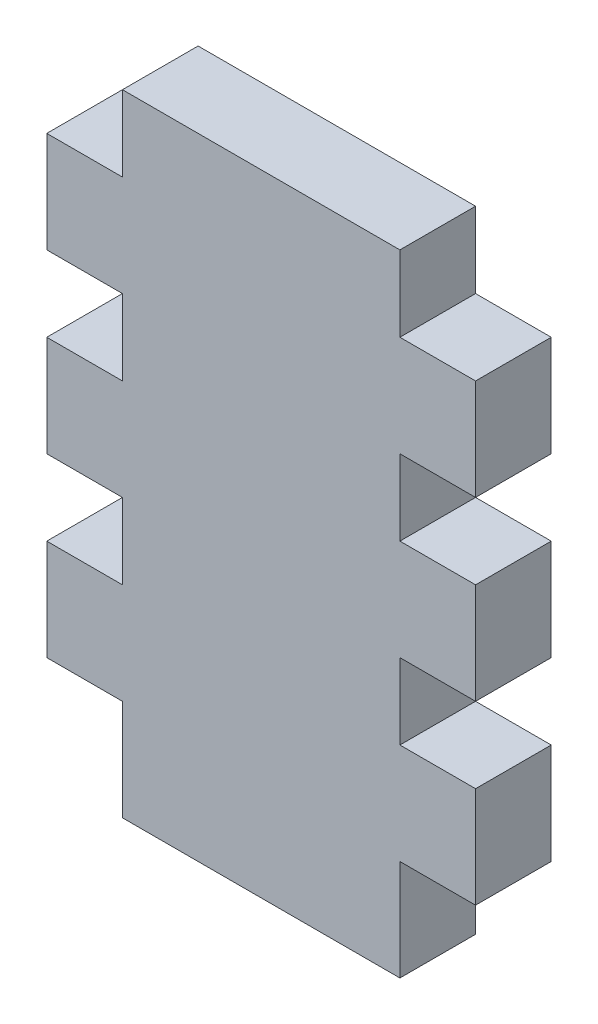
ISO-10303-21;
HEADER;
FILE_DESCRIPTION(('STEP AP214'),'2;1');
FILE_NAME('part.step','',(''),(''),'','','');
FILE_SCHEMA(('AUTOMOTIVE_DESIGN { 1 0 10303 214 1 1 1 1 }'));
ENDSEC;
DATA;
#1=APPLICATION_CONTEXT('core data for automotive mechanical design processes');
#2=APPLICATION_PROTOCOL_DEFINITION('international standard','automotive_design',2000,#1);
#3=PRODUCT_CONTEXT('',#1,'mechanical');
#4=PRODUCT('Part','Part','',(#3));
#5=PRODUCT_RELATED_PRODUCT_CATEGORY('part','',(#4));
#6=PRODUCT_DEFINITION_FORMATION('','',#4);
#7=PRODUCT_DEFINITION_CONTEXT('part definition',#1,'design');
#8=PRODUCT_DEFINITION('design','',#6,#7);
#9=PRODUCT_DEFINITION_SHAPE('','',#8);
#10=(LENGTH_UNIT() NAMED_UNIT(*) SI_UNIT(.MILLI.,.METRE.));
#11=(NAMED_UNIT(*) PLANE_ANGLE_UNIT() SI_UNIT($,.RADIAN.));
#12=(NAMED_UNIT(*) SI_UNIT($,.STERADIAN.) SOLID_ANGLE_UNIT());
#13=UNCERTAINTY_MEASURE_WITH_UNIT(LENGTH_MEASURE(1.E-05),#10,'distance_accuracy_value','');
#14=(GEOMETRIC_REPRESENTATION_CONTEXT(3) GLOBAL_UNCERTAINTY_ASSIGNED_CONTEXT((#13)) GLOBAL_UNIT_ASSIGNED_CONTEXT((#10,
#11,#12)) REPRESENTATION_CONTEXT('',''));
#15=CARTESIAN_POINT('',(0.,0.,0.));
#16=DIRECTION('',(0.,0.,1.));
#17=DIRECTION('',(1.,0.,0.));
#18=AXIS2_PLACEMENT_3D('',#15,#16,#17);
#19=CARTESIAN_POINT('',(7.,-12.5,3.));
#20=DIRECTION('',(-1.,0.,0.));
#21=DIRECTION('',(0.,0.,1.));
#22=AXIS2_PLACEMENT_3D('',#19,#20,#21);
#23=PLANE('',#22);
#24=DIRECTION('',(0.,0.,1.));
#25=VECTOR('',#24,1.);
#26=CARTESIAN_POINT('',(7.,9.49999999999999,0.));
#27=LINE('',#26,#25);
#28=CARTESIAN_POINT('',(7.,9.49999999999999,0.));
#29=VERTEX_POINT('',#28);
#30=CARTESIAN_POINT('',(7.,9.49999999999999,3.));
#31=VERTEX_POINT('',#30);
#32=EDGE_CURVE('E315',#29,#31,#27,.T.);
#33=ORIENTED_EDGE('',*,*,#32,.F.);
#34=DIRECTION('',(0.,1.,0.));
#35=VECTOR('',#34,1.);
#36=CARTESIAN_POINT('',(7.,-12.5,0.));
#37=LINE('',#36,#35);
#38=CARTESIAN_POINT('',(7.,12.5,0.));
#39=VERTEX_POINT('',#38);
#40=EDGE_CURVE('E248',#29,#39,#37,.T.);
#41=ORIENTED_EDGE('',*,*,#40,.T.);
#42=DIRECTION('',(0.,0.,-1.));
#43=VECTOR('',#42,1.);
#44=CARTESIAN_POINT('',(7.,12.5,3.));
#45=LINE('',#44,#43);
#46=CARTESIAN_POINT('',(7.,12.5,3.));
#47=VERTEX_POINT('',#46);
#48=EDGE_CURVE('E11',#47,#39,#45,.T.);
#49=ORIENTED_EDGE('',*,*,#48,.F.);
#50=DIRECTION('',(0.,1.,0.));
#51=VECTOR('',#50,1.);
#52=CARTESIAN_POINT('',(7.,-12.5,3.));
#53=LINE('',#52,#51);
#54=EDGE_CURVE('E267',#31,#47,#53,.T.);
#55=ORIENTED_EDGE('',*,*,#54,.F.);
#56=EDGE_LOOP('',(#33,#41,#49,#55));
#57=FACE_BOUND('',#56,.T.);
#58=ADVANCED_FACE('F38',(#57),#23,.F.);
#59=CARTESIAN_POINT('',(7.,2.49999999999999,0.));
#60=VERTEX_POINT('',#59);
#61=CARTESIAN_POINT('',(7.,5.49999999999999,0.));
#62=VERTEX_POINT('',#61);
#63=EDGE_CURVE('E238',#60,#62,#37,.T.);
#64=ORIENTED_EDGE('',*,*,#63,.T.);
#65=DIRECTION('',(0.,0.,1.));
#66=VECTOR('',#65,1.);
#67=CARTESIAN_POINT('',(7.,5.49999999999999,0.));
#68=LINE('',#67,#66);
#69=CARTESIAN_POINT('',(7.,5.49999999999999,3.));
#70=VERTEX_POINT('',#69);
#71=EDGE_CURVE('E221',#62,#70,#68,.T.);
#72=ORIENTED_EDGE('',*,*,#71,.T.);
#73=CARTESIAN_POINT('',(7.,2.49999999999999,3.));
#74=VERTEX_POINT('',#73);
#75=EDGE_CURVE('E456',#74,#70,#53,.T.);
#76=ORIENTED_EDGE('',*,*,#75,.F.);
#77=DIRECTION('',(0.,0.,1.));
#78=VECTOR('',#77,1.);
#79=CARTESIAN_POINT('',(7.,2.49999999999999,0.));
#80=LINE('',#79,#78);
#81=EDGE_CURVE('E246',#60,#74,#80,.T.);
#82=ORIENTED_EDGE('',*,*,#81,.F.);
#83=EDGE_LOOP('',(#64,#72,#76,#82));
#84=FACE_BOUND('',#83,.T.);
#85=ADVANCED_FACE('F245',(#84),#23,.F.);
#86=CARTESIAN_POINT('',(7.,-4.50000000000001,0.));
#87=VERTEX_POINT('',#86);
#88=CARTESIAN_POINT('',(7.,-1.50000000000001,0.));
#89=VERTEX_POINT('',#88);
#90=EDGE_CURVE('E247',#87,#89,#37,.T.);
#91=ORIENTED_EDGE('',*,*,#90,.T.);
#92=DIRECTION('',(0.,0.,1.));
#93=VECTOR('',#92,1.);
#94=CARTESIAN_POINT('',(7.,-1.50000000000001,0.));
#95=LINE('',#94,#93);
#96=CARTESIAN_POINT('',(7.,-1.50000000000001,3.));
#97=VERTEX_POINT('',#96);
#98=EDGE_CURVE('E420',#89,#97,#95,.T.);
#99=ORIENTED_EDGE('',*,*,#98,.T.);
#100=CARTESIAN_POINT('',(7.,-4.50000000000001,3.));
#101=VERTEX_POINT('',#100);
#102=EDGE_CURVE('E295',#101,#97,#53,.T.);
#103=ORIENTED_EDGE('',*,*,#102,.F.);
#104=DIRECTION('',(0.,0.,1.));
#105=VECTOR('',#104,1.);
#106=CARTESIAN_POINT('',(7.,-4.50000000000001,0.));
#107=LINE('',#106,#105);
#108=EDGE_CURVE('E403',#87,#101,#107,.T.);
#109=ORIENTED_EDGE('',*,*,#108,.F.);
#110=EDGE_LOOP('',(#91,#99,#103,#109));
#111=FACE_BOUND('',#110,.T.);
#112=ADVANCED_FACE('F463',(#111),#23,.F.);
#113=CARTESIAN_POINT('',(-7.,-12.5,3.));
#114=DIRECTION('',(1.,0.,0.));
#115=DIRECTION('',(0.,0.,-1.));
#116=AXIS2_PLACEMENT_3D('',#113,#114,#115);
#117=PLANE('',#116);
#118=DIRECTION('',(0.,-1.,0.));
#119=VECTOR('',#118,1.);
#120=CARTESIAN_POINT('',(-7.,-12.5,3.));
#121=LINE('',#120,#119);
#122=CARTESIAN_POINT('',(-7.,9.49999999999999,3.));
#123=VERTEX_POINT('',#122);
#124=CARTESIAN_POINT('',(-7.,5.49999999999999,3.));
#125=VERTEX_POINT('',#124);
#126=EDGE_CURVE('E273',#123,#125,#121,.T.);
#127=ORIENTED_EDGE('',*,*,#126,.F.);
#128=DIRECTION('',(0.,0.,1.));
#129=VECTOR('',#128,1.);
#130=CARTESIAN_POINT('',(-7.,9.49999999999999,0.));
#131=LINE('',#130,#129);
#132=CARTESIAN_POINT('',(-7.,9.49999999999999,0.));
#133=VERTEX_POINT('',#132);
#134=EDGE_CURVE('E370',#133,#123,#131,.T.);
#135=ORIENTED_EDGE('',*,*,#134,.F.);
#136=DIRECTION('',(0.,-1.,0.));
#137=VECTOR('',#136,1.);
#138=CARTESIAN_POINT('',(-7.,-12.5,0.));
#139=LINE('',#138,#137);
#140=CARTESIAN_POINT('',(-7.,5.49999999999999,0.));
#141=VERTEX_POINT('',#140);
#142=EDGE_CURVE('E265',#133,#141,#139,.T.);
#143=ORIENTED_EDGE('',*,*,#142,.T.);
#144=DIRECTION('',(0.,0.,1.));
#145=VECTOR('',#144,1.);
#146=CARTESIAN_POINT('',(-7.,5.49999999999999,0.));
#147=LINE('',#146,#145);
#148=EDGE_CURVE('E332',#141,#125,#147,.T.);
#149=ORIENTED_EDGE('',*,*,#148,.T.);
#150=EDGE_LOOP('',(#127,#135,#143,#149));
#151=FACE_BOUND('',#150,.T.);
#152=ADVANCED_FACE('F502',(#151),#117,.F.);
#153=CARTESIAN_POINT('',(-7.,2.49999999999999,3.));
#154=VERTEX_POINT('',#153);
#155=CARTESIAN_POINT('',(-7.,-1.50000000000001,3.));
#156=VERTEX_POINT('',#155);
#157=EDGE_CURVE('E279',#154,#156,#121,.T.);
#158=ORIENTED_EDGE('',*,*,#157,.F.);
#159=DIRECTION('',(0.,0.,1.));
#160=VECTOR('',#159,1.);
#161=CARTESIAN_POINT('',(-7.,2.49999999999999,0.));
#162=LINE('',#161,#160);
#163=CARTESIAN_POINT('',(-7.,2.49999999999999,0.));
#164=VERTEX_POINT('',#163);
#165=EDGE_CURVE('E354',#164,#154,#162,.T.);
#166=ORIENTED_EDGE('',*,*,#165,.F.);
#167=CARTESIAN_POINT('',(-7.,-1.50000000000001,0.));
#168=VERTEX_POINT('',#167);
#169=EDGE_CURVE('E264',#164,#168,#139,.T.);
#170=ORIENTED_EDGE('',*,*,#169,.T.);
#171=DIRECTION('',(0.,0.,1.));
#172=VECTOR('',#171,1.);
#173=CARTESIAN_POINT('',(-7.,-1.50000000000001,0.));
#174=LINE('',#173,#172);
#175=EDGE_CURVE('E309',#168,#156,#174,.T.);
#176=ORIENTED_EDGE('',*,*,#175,.T.);
#177=EDGE_LOOP('',(#158,#166,#170,#176));
#178=FACE_BOUND('',#177,.T.);
#179=ADVANCED_FACE('F493',(#178),#117,.F.);
#180=CARTESIAN_POINT('',(7.,-12.5,0.));
#181=VERTEX_POINT('',#180);
#182=CARTESIAN_POINT('',(7.,-8.50000000000001,0.));
#183=VERTEX_POINT('',#182);
#184=EDGE_CURVE('E251',#181,#183,#37,.T.);
#185=ORIENTED_EDGE('',*,*,#184,.T.);
#186=DIRECTION('',(0.,0.,1.));
#187=VECTOR('',#186,1.);
#188=CARTESIAN_POINT('',(7.,-8.50000000000001,0.));
#189=LINE('',#188,#187);
#190=CARTESIAN_POINT('',(7.,-8.50000000000001,3.));
#191=VERTEX_POINT('',#190);
#192=EDGE_CURVE('E394',#183,#191,#189,.T.);
#193=ORIENTED_EDGE('',*,*,#192,.T.);
#194=CARTESIAN_POINT('',(7.,-12.5,3.));
#195=VERTEX_POINT('',#194);
#196=EDGE_CURVE('E292',#195,#191,#53,.T.);
#197=ORIENTED_EDGE('',*,*,#196,.F.);
#198=DIRECTION('',(0.,0.,-1.));
#199=VECTOR('',#198,1.);
#200=CARTESIAN_POINT('',(7.,-12.5,3.));
#201=LINE('',#200,#199);
#202=EDGE_CURVE('E46',#195,#181,#201,.T.);
#203=ORIENTED_EDGE('',*,*,#202,.T.);
#204=EDGE_LOOP('',(#185,#193,#197,#203));
#205=FACE_BOUND('',#204,.T.);
#206=ADVANCED_FACE('F40',(#205),#23,.F.);
#207=CARTESIAN_POINT('',(-7.,12.5,3.));
#208=DIRECTION('',(0.,-1.,0.));
#209=DIRECTION('',(0.,0.,-1.));
#210=AXIS2_PLACEMENT_3D('',#207,#208,#209);
#211=PLANE('',#210);
#212=DIRECTION('',(-1.,0.,0.));
#213=VECTOR('',#212,1.);
#214=CARTESIAN_POINT('',(-7.,12.5,0.));
#215=LINE('',#214,#213);
#216=CARTESIAN_POINT('',(-4.,12.5,0.));
#217=VERTEX_POINT('',#216);
#218=EDGE_CURVE('E256',#39,#217,#215,.T.);
#219=ORIENTED_EDGE('',*,*,#218,.T.);
#220=DIRECTION('',(0.,0.,1.));
#221=VECTOR('',#220,1.);
#222=CARTESIAN_POINT('',(-4.,12.5,0.));
#223=LINE('',#222,#221);
#224=CARTESIAN_POINT('',(-4.,12.5,3.));
#225=VERTEX_POINT('',#224);
#226=EDGE_CURVE('E252',#217,#225,#223,.T.);
#227=ORIENTED_EDGE('',*,*,#226,.T.);
#228=DIRECTION('',(-1.,0.,0.));
#229=VECTOR('',#228,1.);
#230=CARTESIAN_POINT('',(-7.,12.5,3.));
#231=LINE('',#230,#229);
#232=EDGE_CURVE('E287',#47,#225,#231,.T.);
#233=ORIENTED_EDGE('',*,*,#232,.F.);
#234=ORIENTED_EDGE('',*,*,#48,.T.);
#235=EDGE_LOOP('',(#219,#227,#233,#234));
#236=FACE_BOUND('',#235,.T.);
#237=ADVANCED_FACE('F492',(#236),#211,.F.);
#238=CARTESIAN_POINT('',(-7.,-4.50000000000001,3.));
#239=VERTEX_POINT('',#238);
#240=CARTESIAN_POINT('',(-7.,-8.50000000000001,3.));
#241=VERTEX_POINT('',#240);
#242=EDGE_CURVE('E280',#239,#241,#121,.T.);
#243=ORIENTED_EDGE('',*,*,#242,.F.);
#244=DIRECTION('',(0.,0.,1.));
#245=VECTOR('',#244,1.);
#246=CARTESIAN_POINT('',(-7.,-4.50000000000001,0.));
#247=LINE('',#246,#245);
#248=CARTESIAN_POINT('',(-7.,-4.50000000000001,0.));
#249=VERTEX_POINT('',#248);
#250=EDGE_CURVE('E328',#249,#239,#247,.T.);
#251=ORIENTED_EDGE('',*,*,#250,.F.);
#252=CARTESIAN_POINT('',(-7.,-8.50000000000001,0.));
#253=VERTEX_POINT('',#252);
#254=EDGE_CURVE('E261',#249,#253,#139,.T.);
#255=ORIENTED_EDGE('',*,*,#254,.T.);
#256=DIRECTION('',(0.,0.,1.));
#257=VECTOR('',#256,1.);
#258=CARTESIAN_POINT('',(-7.,-8.50000000000001,0.));
#259=LINE('',#258,#257);
#260=EDGE_CURVE('E311',#253,#241,#259,.T.);
#261=ORIENTED_EDGE('',*,*,#260,.T.);
#262=EDGE_LOOP('',(#243,#251,#255,#261));
#263=FACE_BOUND('',#262,.T.);
#264=ADVANCED_FACE('F499',(#263),#117,.F.);
#265=CARTESIAN_POINT('',(-7.,-12.5,3.));
#266=DIRECTION('',(0.,1.,0.));
#267=DIRECTION('',(0.,0.,1.));
#268=AXIS2_PLACEMENT_3D('',#265,#266,#267);
#269=PLANE('',#268);
#270=DIRECTION('',(1.,0.,0.));
#271=VECTOR('',#270,1.);
#272=CARTESIAN_POINT('',(-7.,-12.5,3.));
#273=LINE('',#272,#271);
#274=CARTESIAN_POINT('',(-4.,-12.5,3.));
#275=VERTEX_POINT('',#274);
#276=EDGE_CURVE('E257',#275,#195,#273,.T.);
#277=ORIENTED_EDGE('',*,*,#276,.F.);
#278=DIRECTION('',(0.,0.,1.));
#279=VECTOR('',#278,1.);
#280=CARTESIAN_POINT('',(-4.,-12.5,0.));
#281=LINE('',#280,#279);
#282=CARTESIAN_POINT('',(-4.,-12.5,0.));
#283=VERTEX_POINT('',#282);
#284=EDGE_CURVE('E305',#283,#275,#281,.T.);
#285=ORIENTED_EDGE('',*,*,#284,.F.);
#286=DIRECTION('',(1.,0.,0.));
#287=VECTOR('',#286,1.);
#288=CARTESIAN_POINT('',(-7.,-12.5,0.));
#289=LINE('',#288,#287);
#290=EDGE_CURVE('E266',#283,#181,#289,.T.);
#291=ORIENTED_EDGE('',*,*,#290,.T.);
#292=ORIENTED_EDGE('',*,*,#202,.F.);
#293=EDGE_LOOP('',(#277,#285,#291,#292));
#294=FACE_BOUND('',#293,.T.);
#295=ADVANCED_FACE('F513',(#294),#269,.F.);
#296=CARTESIAN_POINT('',(0.,0.,3.));
#297=DIRECTION('',(0.,0.,-1.));
#298=DIRECTION('',(-1.,0.,0.));
#299=AXIS2_PLACEMENT_3D('',#296,#297,#298);
#300=PLANE('',#299);
#301=ORIENTED_EDGE('',*,*,#232,.T.);
#302=DIRECTION('',(0.,1.,0.));
#303=VECTOR('',#302,1.);
#304=CARTESIAN_POINT('',(-4.,9.49999999999999,3.));
#305=LINE('',#304,#303);
#306=CARTESIAN_POINT('',(-4.,9.49999999999999,3.));
#307=VERTEX_POINT('',#306);
#308=EDGE_CURVE('E377',#307,#225,#305,.T.);
#309=ORIENTED_EDGE('',*,*,#308,.F.);
#310=DIRECTION('',(1.,0.,0.));
#311=VECTOR('',#310,1.);
#312=CARTESIAN_POINT('',(-7.,9.49999999999999,3.));
#313=LINE('',#312,#311);
#314=EDGE_CURVE('E358',#123,#307,#313,.T.);
#315=ORIENTED_EDGE('',*,*,#314,.F.);
#316=ORIENTED_EDGE('',*,*,#126,.T.);
#317=DIRECTION('',(-1.,0.,0.));
#318=VECTOR('',#317,1.);
#319=CARTESIAN_POINT('',(-7.,5.49999999999999,3.));
#320=LINE('',#319,#318);
#321=CARTESIAN_POINT('',(-4.,5.49999999999999,3.));
#322=VERTEX_POINT('',#321);
#323=EDGE_CURVE('E347',#322,#125,#320,.T.);
#324=ORIENTED_EDGE('',*,*,#323,.F.);
#325=DIRECTION('',(0.,1.,0.));
#326=VECTOR('',#325,1.);
#327=CARTESIAN_POINT('',(-4.,5.49999999999999,3.));
#328=LINE('',#327,#326);
#329=CARTESIAN_POINT('',(-4.,2.49999999999999,3.));
#330=VERTEX_POINT('',#329);
#331=EDGE_CURVE('E359',#330,#322,#328,.T.);
#332=ORIENTED_EDGE('',*,*,#331,.F.);
#333=DIRECTION('',(1.,0.,0.));
#334=VECTOR('',#333,1.);
#335=CARTESIAN_POINT('',(-7.,2.49999999999999,3.));
#336=LINE('',#335,#334);
#337=EDGE_CURVE('E355',#154,#330,#336,.T.);
#338=ORIENTED_EDGE('',*,*,#337,.F.);
#339=ORIENTED_EDGE('',*,*,#157,.T.);
#340=DIRECTION('',(-1.,0.,0.));
#341=VECTOR('',#340,1.);
#342=CARTESIAN_POINT('',(-7.,-1.50000000000001,3.));
#343=LINE('',#342,#341);
#344=CARTESIAN_POINT('',(-4.,-1.50000000000001,3.));
#345=VERTEX_POINT('',#344);
#346=EDGE_CURVE('E321',#345,#156,#343,.T.);
#347=ORIENTED_EDGE('',*,*,#346,.F.);
#348=DIRECTION('',(0.,1.,0.));
#349=VECTOR('',#348,1.);
#350=CARTESIAN_POINT('',(-4.,-1.50000000000001,3.));
#351=LINE('',#350,#349);
#352=CARTESIAN_POINT('',(-4.,-4.50000000000001,3.));
#353=VERTEX_POINT('',#352);
#354=EDGE_CURVE('E333',#353,#345,#351,.T.);
#355=ORIENTED_EDGE('',*,*,#354,.F.);
#356=DIRECTION('',(1.,0.,0.));
#357=VECTOR('',#356,1.);
#358=CARTESIAN_POINT('',(-7.,-4.50000000000001,3.));
#359=LINE('',#358,#357);
#360=EDGE_CURVE('E329',#239,#353,#359,.T.);
#361=ORIENTED_EDGE('',*,*,#360,.F.);
#362=ORIENTED_EDGE('',*,*,#242,.T.);
#363=DIRECTION('',(-1.,0.,0.));
#364=VECTOR('',#363,1.);
#365=CARTESIAN_POINT('',(-7.,-8.50000000000001,3.));
#366=LINE('',#365,#364);
#367=CARTESIAN_POINT('',(-4.,-8.50000000000001,3.));
#368=VERTEX_POINT('',#367);
#369=EDGE_CURVE('E301',#368,#241,#366,.T.);
#370=ORIENTED_EDGE('',*,*,#369,.F.);
#371=DIRECTION('',(0.,1.,0.));
#372=VECTOR('',#371,1.);
#373=CARTESIAN_POINT('',(-4.,-8.50000000000001,3.));
#374=LINE('',#373,#372);
#375=EDGE_CURVE('E306',#275,#368,#374,.T.);
#376=ORIENTED_EDGE('',*,*,#375,.F.);
#377=ORIENTED_EDGE('',*,*,#276,.T.);
#378=ORIENTED_EDGE('',*,*,#196,.T.);
#379=DIRECTION('',(1.,0.,0.));
#380=VECTOR('',#379,1.);
#381=CARTESIAN_POINT('',(7.,-8.50000000000001,3.));
#382=LINE('',#381,#380);
#383=CARTESIAN_POINT('',(10.,-8.50000000000001,3.));
#384=VERTEX_POINT('',#383);
#385=EDGE_CURVE('E395',#191,#384,#382,.T.);
#386=ORIENTED_EDGE('',*,*,#385,.T.);
#387=DIRECTION('',(0.,1.,0.));
#388=VECTOR('',#387,1.);
#389=CARTESIAN_POINT('',(10.,-4.50000000000001,3.));
#390=LINE('',#389,#388);
#391=CARTESIAN_POINT('',(10.,-4.50000000000001,3.));
#392=VERTEX_POINT('',#391);
#393=EDGE_CURVE('E398',#384,#392,#390,.T.);
#394=ORIENTED_EDGE('',*,*,#393,.T.);
#395=DIRECTION('',(-1.,0.,0.));
#396=VECTOR('',#395,1.);
#397=CARTESIAN_POINT('',(7.,-4.50000000000001,3.));
#398=LINE('',#397,#396);
#399=EDGE_CURVE('E388',#392,#101,#398,.T.);
#400=ORIENTED_EDGE('',*,*,#399,.T.);
#401=ORIENTED_EDGE('',*,*,#102,.T.);
#402=DIRECTION('',(1.,0.,0.));
#403=VECTOR('',#402,1.);
#404=CARTESIAN_POINT('',(7.,-1.50000000000001,3.));
#405=LINE('',#404,#403);
#406=CARTESIAN_POINT('',(10.,-1.50000000000001,3.));
#407=VERTEX_POINT('',#406);
#408=EDGE_CURVE('E61',#97,#407,#405,.T.);
#409=ORIENTED_EDGE('',*,*,#408,.T.);
#410=DIRECTION('',(0.,1.,0.));
#411=VECTOR('',#410,1.);
#412=CARTESIAN_POINT('',(10.,2.49999999999999,3.));
#413=LINE('',#412,#411);
#414=CARTESIAN_POINT('',(10.,2.49999999999999,3.));
#415=VERTEX_POINT('',#414);
#416=EDGE_CURVE('E422',#407,#415,#413,.T.);
#417=ORIENTED_EDGE('',*,*,#416,.T.);
#418=DIRECTION('',(-1.,0.,0.));
#419=VECTOR('',#418,1.);
#420=CARTESIAN_POINT('',(7.,2.49999999999999,3.));
#421=LINE('',#420,#419);
#422=EDGE_CURVE('E414',#415,#74,#421,.T.);
#423=ORIENTED_EDGE('',*,*,#422,.T.);
#424=ORIENTED_EDGE('',*,*,#75,.T.);
#425=DIRECTION('',(1.,0.,0.));
#426=VECTOR('',#425,1.);
#427=CARTESIAN_POINT('',(7.,5.49999999999999,3.));
#428=LINE('',#427,#426);
#429=CARTESIAN_POINT('',(10.,5.49999999999999,3.));
#430=VERTEX_POINT('',#429);
#431=EDGE_CURVE('E53',#70,#430,#428,.T.);
#432=ORIENTED_EDGE('',*,*,#431,.T.);
#433=DIRECTION('',(0.,1.,0.));
#434=VECTOR('',#433,1.);
#435=CARTESIAN_POINT('',(10.,9.49999999999999,3.));
#436=LINE('',#435,#434);
#437=CARTESIAN_POINT('',(10.,9.49999999999999,3.));
#438=VERTEX_POINT('',#437);
#439=EDGE_CURVE('E439',#430,#438,#436,.T.);
#440=ORIENTED_EDGE('',*,*,#439,.T.);
#441=DIRECTION('',(-1.,0.,0.));
#442=VECTOR('',#441,1.);
#443=CARTESIAN_POINT('',(7.,9.49999999999999,3.));
#444=LINE('',#443,#442);
#445=EDGE_CURVE('E242',#438,#31,#444,.T.);
#446=ORIENTED_EDGE('',*,*,#445,.T.);
#447=ORIENTED_EDGE('',*,*,#54,.T.);
#448=EDGE_LOOP('',(#301,#309,#315,#316,#324,#332,#338,#339,#347,#355,#361,#362,#370,#376,#377,
#378,#386,#394,#400,#401,#409,#417,#423,#424,#432,#440,#446,#447));
#449=FACE_BOUND('',#448,.T.);
#450=ADVANCED_FACE('F459',(#449),#300,.F.);
#451=CARTESIAN_POINT('',(0.,0.,0.));
#452=DIRECTION('',(0.,0.,-1.));
#453=DIRECTION('',(-1.,0.,0.));
#454=AXIS2_PLACEMENT_3D('',#451,#452,#453);
#455=PLANE('',#454);
#456=DIRECTION('',(0.,1.,0.));
#457=VECTOR('',#456,1.);
#458=CARTESIAN_POINT('',(-4.,9.49999999999999,0.));
#459=LINE('',#458,#457);
#460=CARTESIAN_POINT('',(-4.,9.49999999999999,0.));
#461=VERTEX_POINT('',#460);
#462=EDGE_CURVE('E373',#461,#217,#459,.T.);
#463=ORIENTED_EDGE('',*,*,#462,.T.);
#464=ORIENTED_EDGE('',*,*,#218,.F.);
#465=ORIENTED_EDGE('',*,*,#40,.F.);
#466=DIRECTION('',(-1.,0.,0.));
#467=VECTOR('',#466,1.);
#468=CARTESIAN_POINT('',(7.,9.49999999999999,0.));
#469=LINE('',#468,#467);
#470=CARTESIAN_POINT('',(10.,9.49999999999999,0.));
#471=VERTEX_POINT('',#470);
#472=EDGE_CURVE('E230',#471,#29,#469,.T.);
#473=ORIENTED_EDGE('',*,*,#472,.F.);
#474=DIRECTION('',(0.,1.,0.));
#475=VECTOR('',#474,1.);
#476=CARTESIAN_POINT('',(10.,9.49999999999999,0.));
#477=LINE('',#476,#475);
#478=CARTESIAN_POINT('',(10.,5.49999999999999,0.));
#479=VERTEX_POINT('',#478);
#480=EDGE_CURVE('E241',#479,#471,#477,.T.);
#481=ORIENTED_EDGE('',*,*,#480,.F.);
#482=DIRECTION('',(1.,0.,0.));
#483=VECTOR('',#482,1.);
#484=CARTESIAN_POINT('',(7.,5.49999999999999,0.));
#485=LINE('',#484,#483);
#486=EDGE_CURVE('E224',#62,#479,#485,.T.);
#487=ORIENTED_EDGE('',*,*,#486,.F.);
#488=ORIENTED_EDGE('',*,*,#63,.F.);
#489=DIRECTION('',(-1.,0.,0.));
#490=VECTOR('',#489,1.);
#491=CARTESIAN_POINT('',(7.,2.49999999999999,0.));
#492=LINE('',#491,#490);
#493=CARTESIAN_POINT('',(10.,2.49999999999999,0.));
#494=VERTEX_POINT('',#493);
#495=EDGE_CURVE('E418',#494,#60,#492,.T.);
#496=ORIENTED_EDGE('',*,*,#495,.F.);
#497=DIRECTION('',(0.,1.,0.));
#498=VECTOR('',#497,1.);
#499=CARTESIAN_POINT('',(10.,2.49999999999999,0.));
#500=LINE('',#499,#498);
#501=CARTESIAN_POINT('',(10.,-1.50000000000001,0.));
#502=VERTEX_POINT('',#501);
#503=EDGE_CURVE('E415',#502,#494,#500,.T.);
#504=ORIENTED_EDGE('',*,*,#503,.F.);
#505=DIRECTION('',(1.,0.,0.));
#506=VECTOR('',#505,1.);
#507=CARTESIAN_POINT('',(7.,-1.50000000000001,0.));
#508=LINE('',#507,#506);
#509=EDGE_CURVE('E411',#89,#502,#508,.T.);
#510=ORIENTED_EDGE('',*,*,#509,.F.);
#511=ORIENTED_EDGE('',*,*,#90,.F.);
#512=DIRECTION('',(-1.,0.,0.));
#513=VECTOR('',#512,1.);
#514=CARTESIAN_POINT('',(7.,-4.50000000000001,0.));
#515=LINE('',#514,#513);
#516=CARTESIAN_POINT('',(10.,-4.50000000000001,0.));
#517=VERTEX_POINT('',#516);
#518=EDGE_CURVE('E392',#517,#87,#515,.T.);
#519=ORIENTED_EDGE('',*,*,#518,.F.);
#520=DIRECTION('',(0.,1.,0.));
#521=VECTOR('',#520,1.);
#522=CARTESIAN_POINT('',(10.,-4.50000000000001,0.));
#523=LINE('',#522,#521);
#524=CARTESIAN_POINT('',(10.,-8.50000000000001,0.));
#525=VERTEX_POINT('',#524);
#526=EDGE_CURVE('E389',#525,#517,#523,.T.);
#527=ORIENTED_EDGE('',*,*,#526,.F.);
#528=DIRECTION('',(1.,0.,0.));
#529=VECTOR('',#528,1.);
#530=CARTESIAN_POINT('',(7.,-8.50000000000001,0.));
#531=LINE('',#530,#529);
#532=EDGE_CURVE('E385',#183,#525,#531,.T.);
#533=ORIENTED_EDGE('',*,*,#532,.F.);
#534=ORIENTED_EDGE('',*,*,#184,.F.);
#535=ORIENTED_EDGE('',*,*,#290,.F.);
#536=DIRECTION('',(0.,1.,0.));
#537=VECTOR('',#536,1.);
#538=CARTESIAN_POINT('',(-4.,-8.50000000000001,0.));
#539=LINE('',#538,#537);
#540=CARTESIAN_POINT('',(-4.,-8.50000000000001,0.));
#541=VERTEX_POINT('',#540);
#542=EDGE_CURVE('E298',#283,#541,#539,.T.);
#543=ORIENTED_EDGE('',*,*,#542,.T.);
#544=DIRECTION('',(-1.,0.,0.));
#545=VECTOR('',#544,1.);
#546=CARTESIAN_POINT('',(-7.,-8.50000000000001,0.));
#547=LINE('',#546,#545);
#548=EDGE_CURVE('E302',#541,#253,#547,.T.);
#549=ORIENTED_EDGE('',*,*,#548,.T.);
#550=ORIENTED_EDGE('',*,*,#254,.F.);
#551=DIRECTION('',(1.,0.,0.));
#552=VECTOR('',#551,1.);
#553=CARTESIAN_POINT('',(-7.,-4.50000000000001,0.));
#554=LINE('',#553,#552);
#555=CARTESIAN_POINT('',(-4.,-4.50000000000001,0.));
#556=VERTEX_POINT('',#555);
#557=EDGE_CURVE('E318',#249,#556,#554,.T.);
#558=ORIENTED_EDGE('',*,*,#557,.T.);
#559=DIRECTION('',(0.,1.,0.));
#560=VECTOR('',#559,1.);
#561=CARTESIAN_POINT('',(-4.,-1.50000000000001,0.));
#562=LINE('',#561,#560);
#563=CARTESIAN_POINT('',(-4.,-1.50000000000001,0.));
#564=VERTEX_POINT('',#563);
#565=EDGE_CURVE('E322',#556,#564,#562,.T.);
#566=ORIENTED_EDGE('',*,*,#565,.T.);
#567=DIRECTION('',(-1.,0.,0.));
#568=VECTOR('',#567,1.);
#569=CARTESIAN_POINT('',(-7.,-1.50000000000001,0.));
#570=LINE('',#569,#568);
#571=EDGE_CURVE('E325',#564,#168,#570,.T.);
#572=ORIENTED_EDGE('',*,*,#571,.T.);
#573=ORIENTED_EDGE('',*,*,#169,.F.);
#574=DIRECTION('',(1.,0.,0.));
#575=VECTOR('',#574,1.);
#576=CARTESIAN_POINT('',(-7.,2.49999999999999,0.));
#577=LINE('',#576,#575);
#578=CARTESIAN_POINT('',(-4.,2.49999999999999,0.));
#579=VERTEX_POINT('',#578);
#580=EDGE_CURVE('E344',#164,#579,#577,.T.);
#581=ORIENTED_EDGE('',*,*,#580,.T.);
#582=DIRECTION('',(0.,1.,0.));
#583=VECTOR('',#582,1.);
#584=CARTESIAN_POINT('',(-4.,5.49999999999999,0.));
#585=LINE('',#584,#583);
#586=CARTESIAN_POINT('',(-4.,5.49999999999999,0.));
#587=VERTEX_POINT('',#586);
#588=EDGE_CURVE('E348',#579,#587,#585,.T.);
#589=ORIENTED_EDGE('',*,*,#588,.T.);
#590=DIRECTION('',(-1.,0.,0.));
#591=VECTOR('',#590,1.);
#592=CARTESIAN_POINT('',(-7.,5.49999999999999,0.));
#593=LINE('',#592,#591);
#594=EDGE_CURVE('E351',#587,#141,#593,.T.);
#595=ORIENTED_EDGE('',*,*,#594,.T.);
#596=ORIENTED_EDGE('',*,*,#142,.F.);
#597=DIRECTION('',(1.,0.,0.));
#598=VECTOR('',#597,1.);
#599=CARTESIAN_POINT('',(-7.,9.49999999999999,0.));
#600=LINE('',#599,#598);
#601=EDGE_CURVE('E379',#133,#461,#600,.T.);
#602=ORIENTED_EDGE('',*,*,#601,.T.);
#603=EDGE_LOOP('',(#463,#464,#465,#473,#481,#487,#488,#496,#504,#510,#511,#519,#527,#533,#534,
#535,#543,#549,#550,#558,#566,#572,#573,#581,#589,#595,#596,#602));
#604=FACE_BOUND('',#603,.T.);
#605=ADVANCED_FACE('F236',(#604),#455,.T.);
#606=CARTESIAN_POINT('',(-7.,-8.50000000000001,0.));
#607=DIRECTION('',(0.,1.,0.));
#608=DIRECTION('',(0.,0.,1.));
#609=AXIS2_PLACEMENT_3D('',#606,#607,#608);
#610=PLANE('',#609);
#611=ORIENTED_EDGE('',*,*,#369,.T.);
#612=ORIENTED_EDGE('',*,*,#260,.F.);
#613=ORIENTED_EDGE('',*,*,#548,.F.);
#614=DIRECTION('',(0.,0.,1.));
#615=VECTOR('',#614,1.);
#616=CARTESIAN_POINT('',(-4.,-8.50000000000001,0.));
#617=LINE('',#616,#615);
#618=EDGE_CURVE('E314',#541,#368,#617,.T.);
#619=ORIENTED_EDGE('',*,*,#618,.T.);
#620=EDGE_LOOP('',(#611,#612,#613,#619));
#621=FACE_BOUND('',#620,.T.);
#622=ADVANCED_FACE('F522',(#621),#610,.F.);
#623=CARTESIAN_POINT('',(-4.,-8.50000000000001,0.));
#624=DIRECTION('',(1.,0.,0.));
#625=DIRECTION('',(0.,0.,-1.));
#626=AXIS2_PLACEMENT_3D('',#623,#624,#625);
#627=PLANE('',#626);
#628=ORIENTED_EDGE('',*,*,#375,.T.);
#629=ORIENTED_EDGE('',*,*,#618,.F.);
#630=ORIENTED_EDGE('',*,*,#542,.F.);
#631=ORIENTED_EDGE('',*,*,#284,.T.);
#632=EDGE_LOOP('',(#628,#629,#630,#631));
#633=FACE_BOUND('',#632,.T.);
#634=ADVANCED_FACE('F527',(#633),#627,.F.);
#635=CARTESIAN_POINT('',(-7.,-1.50000000000001,0.));
#636=DIRECTION('',(0.,1.,0.));
#637=DIRECTION('',(-1.,0.,0.));
#638=AXIS2_PLACEMENT_3D('',#635,#636,#637);
#639=PLANE('',#638);
#640=ORIENTED_EDGE('',*,*,#346,.T.);
#641=ORIENTED_EDGE('',*,*,#175,.F.);
#642=ORIENTED_EDGE('',*,*,#571,.F.);
#643=DIRECTION('',(0.,0.,1.));
#644=VECTOR('',#643,1.);
#645=CARTESIAN_POINT('',(-4.,-1.50000000000001,0.));
#646=LINE('',#645,#644);
#647=EDGE_CURVE('E339',#564,#345,#646,.T.);
#648=ORIENTED_EDGE('',*,*,#647,.T.);
#649=EDGE_LOOP('',(#640,#641,#642,#648));
#650=FACE_BOUND('',#649,.T.);
#651=ADVANCED_FACE('F568',(#650),#639,.F.);
#652=CARTESIAN_POINT('',(-4.,-1.50000000000001,0.));
#653=DIRECTION('',(1.,0.,0.));
#654=DIRECTION('',(0.,0.,-1.));
#655=AXIS2_PLACEMENT_3D('',#652,#653,#654);
#656=PLANE('',#655);
#657=ORIENTED_EDGE('',*,*,#354,.T.);
#658=ORIENTED_EDGE('',*,*,#647,.F.);
#659=ORIENTED_EDGE('',*,*,#565,.F.);
#660=DIRECTION('',(0.,0.,1.));
#661=VECTOR('',#660,1.);
#662=CARTESIAN_POINT('',(-4.,-4.50000000000001,0.));
#663=LINE('',#662,#661);
#664=EDGE_CURVE('E341',#556,#353,#663,.T.);
#665=ORIENTED_EDGE('',*,*,#664,.T.);
#666=EDGE_LOOP('',(#657,#658,#659,#665));
#667=FACE_BOUND('',#666,.T.);
#668=ADVANCED_FACE('F564',(#667),#656,.F.);
#669=CARTESIAN_POINT('',(-7.,-4.50000000000001,0.));
#670=DIRECTION('',(0.,-1.,0.));
#671=DIRECTION('',(0.,0.,-1.));
#672=AXIS2_PLACEMENT_3D('',#669,#670,#671);
#673=PLANE('',#672);
#674=ORIENTED_EDGE('',*,*,#360,.T.);
#675=ORIENTED_EDGE('',*,*,#664,.F.);
#676=ORIENTED_EDGE('',*,*,#557,.F.);
#677=ORIENTED_EDGE('',*,*,#250,.T.);
#678=EDGE_LOOP('',(#674,#675,#676,#677));
#679=FACE_BOUND('',#678,.T.);
#680=ADVANCED_FACE('F560',(#679),#673,.F.);
#681=CARTESIAN_POINT('',(-7.,5.49999999999999,0.));
#682=DIRECTION('',(0.,1.,0.));
#683=DIRECTION('',(0.,0.,1.));
#684=AXIS2_PLACEMENT_3D('',#681,#682,#683);
#685=PLANE('',#684);
#686=ORIENTED_EDGE('',*,*,#323,.T.);
#687=ORIENTED_EDGE('',*,*,#148,.F.);
#688=ORIENTED_EDGE('',*,*,#594,.F.);
#689=DIRECTION('',(0.,0.,1.));
#690=VECTOR('',#689,1.);
#691=CARTESIAN_POINT('',(-4.,5.49999999999999,0.));
#692=LINE('',#691,#690);
#693=EDGE_CURVE('E365',#587,#322,#692,.T.);
#694=ORIENTED_EDGE('',*,*,#693,.T.);
#695=EDGE_LOOP('',(#686,#687,#688,#694));
#696=FACE_BOUND('',#695,.T.);
#697=ADVANCED_FACE('F556',(#696),#685,.F.);
#698=CARTESIAN_POINT('',(-4.,5.49999999999999,0.));
#699=DIRECTION('',(1.,0.,0.));
#700=DIRECTION('',(0.,0.,-1.));
#701=AXIS2_PLACEMENT_3D('',#698,#699,#700);
#702=PLANE('',#701);
#703=ORIENTED_EDGE('',*,*,#331,.T.);
#704=ORIENTED_EDGE('',*,*,#693,.F.);
#705=ORIENTED_EDGE('',*,*,#588,.F.);
#706=DIRECTION('',(0.,0.,1.));
#707=VECTOR('',#706,1.);
#708=CARTESIAN_POINT('',(-4.,2.49999999999999,0.));
#709=LINE('',#708,#707);
#710=EDGE_CURVE('E367',#579,#330,#709,.T.);
#711=ORIENTED_EDGE('',*,*,#710,.T.);
#712=EDGE_LOOP('',(#703,#704,#705,#711));
#713=FACE_BOUND('',#712,.T.);
#714=ADVANCED_FACE('F552',(#713),#702,.F.);
#715=CARTESIAN_POINT('',(-7.,2.49999999999999,0.));
#716=DIRECTION('',(0.,-1.,0.));
#717=DIRECTION('',(0.,0.,-1.));
#718=AXIS2_PLACEMENT_3D('',#715,#716,#717);
#719=PLANE('',#718);
#720=ORIENTED_EDGE('',*,*,#337,.T.);
#721=ORIENTED_EDGE('',*,*,#710,.F.);
#722=ORIENTED_EDGE('',*,*,#580,.F.);
#723=ORIENTED_EDGE('',*,*,#165,.T.);
#724=EDGE_LOOP('',(#720,#721,#722,#723));
#725=FACE_BOUND('',#724,.T.);
#726=ADVANCED_FACE('F547',(#725),#719,.F.);
#727=CARTESIAN_POINT('',(-4.,9.49999999999999,0.));
#728=DIRECTION('',(1.,0.,0.));
#729=DIRECTION('',(0.,0.,-1.));
#730=AXIS2_PLACEMENT_3D('',#727,#728,#729);
#731=PLANE('',#730);
#732=ORIENTED_EDGE('',*,*,#308,.T.);
#733=ORIENTED_EDGE('',*,*,#226,.F.);
#734=ORIENTED_EDGE('',*,*,#462,.F.);
#735=DIRECTION('',(0.,0.,1.));
#736=VECTOR('',#735,1.);
#737=CARTESIAN_POINT('',(-4.,9.49999999999999,0.));
#738=LINE('',#737,#736);
#739=EDGE_CURVE('E372',#461,#307,#738,.T.);
#740=ORIENTED_EDGE('',*,*,#739,.T.);
#741=EDGE_LOOP('',(#732,#733,#734,#740));
#742=FACE_BOUND('',#741,.T.);
#743=ADVANCED_FACE('F542',(#742),#731,.F.);
#744=CARTESIAN_POINT('',(-7.,9.49999999999999,0.));
#745=DIRECTION('',(0.,-1.,0.));
#746=DIRECTION('',(0.,0.,-1.));
#747=AXIS2_PLACEMENT_3D('',#744,#745,#746);
#748=PLANE('',#747);
#749=ORIENTED_EDGE('',*,*,#314,.T.);
#750=ORIENTED_EDGE('',*,*,#739,.F.);
#751=ORIENTED_EDGE('',*,*,#601,.F.);
#752=ORIENTED_EDGE('',*,*,#134,.T.);
#753=EDGE_LOOP('',(#749,#750,#751,#752));
#754=FACE_BOUND('',#753,.T.);
#755=ADVANCED_FACE('F535',(#754),#748,.F.);
#756=CARTESIAN_POINT('',(7.,-4.50000000000001,0.));
#757=DIRECTION('',(0.,1.,0.));
#758=DIRECTION('',(0.,0.,1.));
#759=AXIS2_PLACEMENT_3D('',#756,#757,#758);
#760=PLANE('',#759);
#761=ORIENTED_EDGE('',*,*,#399,.F.);
#762=DIRECTION('',(0.,0.,1.));
#763=VECTOR('',#762,1.);
#764=CARTESIAN_POINT('',(10.,-4.50000000000001,0.));
#765=LINE('',#764,#763);
#766=EDGE_CURVE('E405',#517,#392,#765,.T.);
#767=ORIENTED_EDGE('',*,*,#766,.F.);
#768=ORIENTED_EDGE('',*,*,#518,.T.);
#769=ORIENTED_EDGE('',*,*,#108,.T.);
#770=EDGE_LOOP('',(#761,#767,#768,#769));
#771=FACE_BOUND('',#770,.T.);
#772=ADVANCED_FACE('F533',(#771),#760,.T.);
#773=CARTESIAN_POINT('',(10.,-4.50000000000001,0.));
#774=DIRECTION('',(1.,0.,0.));
#775=DIRECTION('',(0.,1.,0.));
#776=AXIS2_PLACEMENT_3D('',#773,#774,#775);
#777=PLANE('',#776);
#778=ORIENTED_EDGE('',*,*,#393,.F.);
#779=DIRECTION('',(0.,0.,1.));
#780=VECTOR('',#779,1.);
#781=CARTESIAN_POINT('',(10.,-8.50000000000001,0.));
#782=LINE('',#781,#780);
#783=EDGE_CURVE('E407',#525,#384,#782,.T.);
#784=ORIENTED_EDGE('',*,*,#783,.F.);
#785=ORIENTED_EDGE('',*,*,#526,.T.);
#786=ORIENTED_EDGE('',*,*,#766,.T.);
#787=EDGE_LOOP('',(#778,#784,#785,#786));
#788=FACE_BOUND('',#787,.T.);
#789=ADVANCED_FACE('F483',(#788),#777,.T.);
#790=CARTESIAN_POINT('',(7.,-8.50000000000001,0.));
#791=DIRECTION('',(0.,-1.,0.));
#792=DIRECTION('',(0.,0.,-1.));
#793=AXIS2_PLACEMENT_3D('',#790,#791,#792);
#794=PLANE('',#793);
#795=ORIENTED_EDGE('',*,*,#385,.F.);
#796=ORIENTED_EDGE('',*,*,#192,.F.);
#797=ORIENTED_EDGE('',*,*,#532,.T.);
#798=ORIENTED_EDGE('',*,*,#783,.T.);
#799=EDGE_LOOP('',(#795,#796,#797,#798));
#800=FACE_BOUND('',#799,.T.);
#801=ADVANCED_FACE('F476',(#800),#794,.T.);
#802=CARTESIAN_POINT('',(7.,2.49999999999999,0.));
#803=DIRECTION('',(0.,1.,0.));
#804=DIRECTION('',(-1.,0.,0.));
#805=AXIS2_PLACEMENT_3D('',#802,#803,#804);
#806=PLANE('',#805);
#807=ORIENTED_EDGE('',*,*,#422,.F.);
#808=DIRECTION('',(0.,0.,1.));
#809=VECTOR('',#808,1.);
#810=CARTESIAN_POINT('',(10.,2.49999999999999,0.));
#811=LINE('',#810,#809);
#812=EDGE_CURVE('E428',#494,#415,#811,.T.);
#813=ORIENTED_EDGE('',*,*,#812,.F.);
#814=ORIENTED_EDGE('',*,*,#495,.T.);
#815=ORIENTED_EDGE('',*,*,#81,.T.);
#816=EDGE_LOOP('',(#807,#813,#814,#815));
#817=FACE_BOUND('',#816,.T.);
#818=ADVANCED_FACE('F474',(#817),#806,.T.);
#819=CARTESIAN_POINT('',(10.,2.49999999999999,0.));
#820=DIRECTION('',(1.,0.,0.));
#821=DIRECTION('',(0.,1.,0.));
#822=AXIS2_PLACEMENT_3D('',#819,#820,#821);
#823=PLANE('',#822);
#824=ORIENTED_EDGE('',*,*,#416,.F.);
#825=DIRECTION('',(0.,0.,1.));
#826=VECTOR('',#825,1.);
#827=CARTESIAN_POINT('',(10.,-1.50000000000001,0.));
#828=LINE('',#827,#826);
#829=EDGE_CURVE('E430',#502,#407,#828,.T.);
#830=ORIENTED_EDGE('',*,*,#829,.F.);
#831=ORIENTED_EDGE('',*,*,#503,.T.);
#832=ORIENTED_EDGE('',*,*,#812,.T.);
#833=EDGE_LOOP('',(#824,#830,#831,#832));
#834=FACE_BOUND('',#833,.T.);
#835=ADVANCED_FACE('F471',(#834),#823,.T.);
#836=CARTESIAN_POINT('',(7.,-1.50000000000001,0.));
#837=DIRECTION('',(0.,-1.,0.));
#838=DIRECTION('',(0.,0.,-1.));
#839=AXIS2_PLACEMENT_3D('',#836,#837,#838);
#840=PLANE('',#839);
#841=ORIENTED_EDGE('',*,*,#408,.F.);
#842=ORIENTED_EDGE('',*,*,#98,.F.);
#843=ORIENTED_EDGE('',*,*,#509,.T.);
#844=ORIENTED_EDGE('',*,*,#829,.T.);
#845=EDGE_LOOP('',(#841,#842,#843,#844));
#846=FACE_BOUND('',#845,.T.);
#847=ADVANCED_FACE('F466',(#846),#840,.T.);
#848=CARTESIAN_POINT('',(7.,9.49999999999999,0.));
#849=DIRECTION('',(0.,1.,0.));
#850=DIRECTION('',(-1.,0.,0.));
#851=AXIS2_PLACEMENT_3D('',#848,#849,#850);
#852=PLANE('',#851);
#853=ORIENTED_EDGE('',*,*,#445,.F.);
#854=DIRECTION('',(0.,0.,1.));
#855=VECTOR('',#854,1.);
#856=CARTESIAN_POINT('',(10.,9.49999999999999,0.));
#857=LINE('',#856,#855);
#858=EDGE_CURVE('E434',#471,#438,#857,.T.);
#859=ORIENTED_EDGE('',*,*,#858,.F.);
#860=ORIENTED_EDGE('',*,*,#472,.T.);
#861=ORIENTED_EDGE('',*,*,#32,.T.);
#862=EDGE_LOOP('',(#853,#859,#860,#861));
#863=FACE_BOUND('',#862,.T.);
#864=ADVANCED_FACE('F452',(#863),#852,.T.);
#865=CARTESIAN_POINT('',(10.,9.49999999999999,0.));
#866=DIRECTION('',(1.,0.,0.));
#867=DIRECTION('',(0.,1.,0.));
#868=AXIS2_PLACEMENT_3D('',#865,#866,#867);
#869=PLANE('',#868);
#870=ORIENTED_EDGE('',*,*,#439,.F.);
#871=DIRECTION('',(0.,0.,1.));
#872=VECTOR('',#871,1.);
#873=CARTESIAN_POINT('',(10.,5.49999999999999,0.));
#874=LINE('',#873,#872);
#875=EDGE_CURVE('E229',#479,#430,#874,.T.);
#876=ORIENTED_EDGE('',*,*,#875,.F.);
#877=ORIENTED_EDGE('',*,*,#480,.T.);
#878=ORIENTED_EDGE('',*,*,#858,.T.);
#879=EDGE_LOOP('',(#870,#876,#877,#878));
#880=FACE_BOUND('',#879,.T.);
#881=ADVANCED_FACE('F446',(#880),#869,.T.);
#882=CARTESIAN_POINT('',(7.,5.49999999999999,0.));
#883=DIRECTION('',(0.,-1.,0.));
#884=DIRECTION('',(1.,0.,0.));
#885=AXIS2_PLACEMENT_3D('',#882,#883,#884);
#886=PLANE('',#885);
#887=ORIENTED_EDGE('',*,*,#431,.F.);
#888=ORIENTED_EDGE('',*,*,#71,.F.);
#889=ORIENTED_EDGE('',*,*,#486,.T.);
#890=ORIENTED_EDGE('',*,*,#875,.T.);
#891=EDGE_LOOP('',(#887,#888,#889,#890));
#892=FACE_BOUND('',#891,.T.);
#893=ADVANCED_FACE('F223',(#892),#886,.T.);
#894=CLOSED_SHELL('',(#58,#85,#112,#152,#179,#206,#237,#264,#295,#450,#605,#622,#634,#651,#668,
#680,#697,#714,#726,#743,#755,#772,#789,#801,#818,#835,#847,#864,#881,#893));
#895=MANIFOLD_SOLID_BREP('B2',#894);
#896=ADVANCED_BREP_SHAPE_REPRESENTATION('',(#18,#895),#14);
#897=SHAPE_DEFINITION_REPRESENTATION(#9,#896);
ENDSEC;
END-ISO-10303-21;
